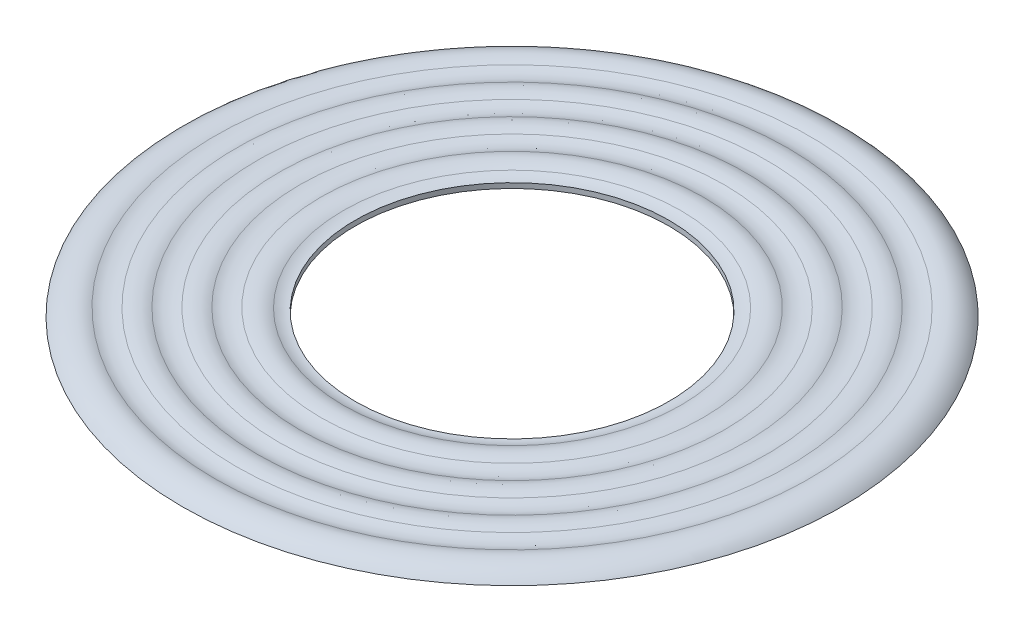
ISO-10303-21;
HEADER;
FILE_DESCRIPTION(('STEP AP214'),'2;1');
FILE_NAME('part.step','',(''),(''),'','','');
FILE_SCHEMA(('AUTOMOTIVE_DESIGN { 1 0 10303 214 1 1 1 1 }'));
ENDSEC;
DATA;
#1=APPLICATION_CONTEXT('core data for automotive mechanical design processes');
#2=APPLICATION_PROTOCOL_DEFINITION('international standard','automotive_design',2000,#1);
#3=PRODUCT_CONTEXT('',#1,'mechanical');
#4=PRODUCT('Part','Part','',(#3));
#5=PRODUCT_RELATED_PRODUCT_CATEGORY('part','',(#4));
#6=PRODUCT_DEFINITION_FORMATION('','',#4);
#7=PRODUCT_DEFINITION_CONTEXT('part definition',#1,'design');
#8=PRODUCT_DEFINITION('design','',#6,#7);
#9=PRODUCT_DEFINITION_SHAPE('','',#8);
#10=(LENGTH_UNIT() NAMED_UNIT(*) SI_UNIT(.MILLI.,.METRE.));
#11=(NAMED_UNIT(*) PLANE_ANGLE_UNIT() SI_UNIT($,.RADIAN.));
#12=(NAMED_UNIT(*) SI_UNIT($,.STERADIAN.) SOLID_ANGLE_UNIT());
#13=UNCERTAINTY_MEASURE_WITH_UNIT(LENGTH_MEASURE(1.E-05),#10,'distance_accuracy_value','');
#14=(GEOMETRIC_REPRESENTATION_CONTEXT(3) GLOBAL_UNCERTAINTY_ASSIGNED_CONTEXT((#13)) GLOBAL_UNIT_ASSIGNED_CONTEXT((#10,
#11,#12)) REPRESENTATION_CONTEXT('',''));
#15=CARTESIAN_POINT('',(0.,0.,0.));
#16=DIRECTION('',(0.,0.,1.));
#17=DIRECTION('',(1.,0.,0.));
#18=AXIS2_PLACEMENT_3D('',#15,#16,#17);
#19=CARTESIAN_POINT('',(-33.3375,-0.508,0.));
#20=DIRECTION('',(0.,-1.,0.));
#21=DIRECTION('',(0.,0.,-1.));
#22=AXIS2_PLACEMENT_3D('',#19,#20,#21);
#23=PLANE('',#22);
#24=CARTESIAN_POINT('',(0.,-0.508000000000002,0.));
#25=DIRECTION('',(0.,1.,0.));
#26=DIRECTION('',(0.,0.,1.));
#27=AXIS2_PLACEMENT_3D('',#24,#25,#26);
#28=CIRCLE('',#27,15.875);
#29=CARTESIAN_POINT('',(0.,-0.508000000000002,15.875));
#30=VERTEX_POINT('',#29);
#31=EDGE_CURVE('E69',#30,#30,#28,.T.);
#32=ORIENTED_EDGE('',*,*,#31,.T.);
#33=EDGE_LOOP('',(#32));
#34=FACE_BOUND('',#33,.T.);
#35=CARTESIAN_POINT('',(0.,-0.508,0.));
#36=DIRECTION('',(0.,-1.,0.));
#37=DIRECTION('',(0.,0.,-1.));
#38=AXIS2_PLACEMENT_3D('',#35,#36,#37);
#39=CIRCLE('',#38,16.7166681342821);
#40=CARTESIAN_POINT('',(0.,-0.508,-16.7166681342821));
#41=VERTEX_POINT('',#40);
#42=EDGE_CURVE('E84',#41,#41,#39,.T.);
#43=ORIENTED_EDGE('',*,*,#42,.T.);
#44=EDGE_LOOP('',(#43));
#45=FACE_BOUND('',#44,.T.);
#46=ADVANCED_FACE('F34',(#34,#45),#23,.T.);
#47=CARTESIAN_POINT('',(0.,-0.507999999999998,0.));
#48=DIRECTION('',(0.,1.,0.));
#49=DIRECTION('',(0.,0.,1.));
#50=AXIS2_PLACEMENT_3D('',#47,#48,#49);
#51=CIRCLE('',#50,33.3375);
#52=CARTESIAN_POINT('',(0.,-0.507999999999998,33.3375));
#53=VERTEX_POINT('',#52);
#54=EDGE_CURVE('E73',#53,#53,#51,.T.);
#55=ORIENTED_EDGE('',*,*,#54,.F.);
#56=EDGE_LOOP('',(#55));
#57=FACE_BOUND('',#56,.T.);
#58=CARTESIAN_POINT('',(0.,-0.508,0.));
#59=DIRECTION('',(0.,-1.,0.));
#60=DIRECTION('',(0.,0.,-1.));
#61=AXIS2_PLACEMENT_3D('',#58,#59,#60);
#62=CIRCLE('',#61,32.4312477668388);
#63=CARTESIAN_POINT('',(0.,-0.508,-32.4312477668388));
#64=VERTEX_POINT('',#63);
#65=EDGE_CURVE('E89',#64,#64,#62,.F.);
#66=ORIENTED_EDGE('',*,*,#65,.T.);
#67=EDGE_LOOP('',(#66));
#68=FACE_BOUND('',#67,.T.);
#69=ADVANCED_FACE('F160',(#57,#68),#23,.T.);
#70=CARTESIAN_POINT('',(0.,-2.41944630052116,0.));
#71=DIRECTION('',(0.,1.,0.));
#72=DIRECTION('',(0.,0.,1.));
#73=AXIS2_PLACEMENT_3D('',#70,#71,#72);
#74=TOROIDAL_SURFACE('',#73,26.8336418073314,2.92744630052116);
#75=CARTESIAN_POINT('',(0.,0.304799999999997,0.));
#76=DIRECTION('',(0.,1.,0.));
#77=DIRECTION('',(0.,0.,1.));
#78=AXIS2_PLACEMENT_3D('',#75,#76,#77);
#79=CIRCLE('',#78,27.9052872414801);
#80=CARTESIAN_POINT('',(0.,0.304799999999997,27.9052872414801));
#81=VERTEX_POINT('',#80);
#82=EDGE_CURVE('E80',#81,#81,#79,.T.);
#83=ORIENTED_EDGE('',*,*,#82,.T.);
#84=EDGE_LOOP('',(#83));
#85=FACE_BOUND('',#84,.T.);
#86=CARTESIAN_POINT('',(0.,0.304800000000001,0.));
#87=DIRECTION('',(0.,1.,0.));
#88=DIRECTION('',(0.,0.,1.));
#89=AXIS2_PLACEMENT_3D('',#86,#87,#88);
#90=CIRCLE('',#89,25.7619963731826);
#91=CARTESIAN_POINT('',(0.,0.304800000000001,25.7619963731826));
#92=VERTEX_POINT('',#91);
#93=EDGE_CURVE('E10',#92,#92,#90,.T.);
#94=ORIENTED_EDGE('',*,*,#93,.F.);
#95=EDGE_LOOP('',(#94));
#96=FACE_BOUND('',#95,.T.);
#97=ADVANCED_FACE('F36',(#85,#96),#74,.T.);
#98=CARTESIAN_POINT('',(0.,3.02904630052116,0.));
#99=DIRECTION('',(0.,1.,0.));
#100=DIRECTION('',(0.,0.,1.));
#101=AXIS2_PLACEMENT_3D('',#98,#99,#100);
#102=TOROIDAL_SURFACE('',#101,24.6903509390339,2.92744630052116);
#103=ORIENTED_EDGE('',*,*,#93,.T.);
#104=EDGE_LOOP('',(#103));
#105=FACE_BOUND('',#104,.T.);
#106=CARTESIAN_POINT('',(0.,0.304799999999997,0.));
#107=DIRECTION('',(0.,1.,0.));
#108=DIRECTION('',(0.,0.,1.));
#109=AXIS2_PLACEMENT_3D('',#106,#107,#108);
#110=CIRCLE('',#109,23.6187055048852);
#111=CARTESIAN_POINT('',(0.,0.304799999999997,23.6187055048852));
#112=VERTEX_POINT('',#111);
#113=EDGE_CURVE('E42',#112,#112,#110,.T.);
#114=ORIENTED_EDGE('',*,*,#113,.F.);
#115=EDGE_LOOP('',(#114));
#116=FACE_BOUND('',#115,.T.);
#117=ADVANCED_FACE('F189',(#105,#116),#102,.F.);
#118=CARTESIAN_POINT('',(0.,-2.41944630052116,0.));
#119=DIRECTION('',(0.,1.,0.));
#120=DIRECTION('',(0.,0.,1.));
#121=AXIS2_PLACEMENT_3D('',#118,#119,#120);
#122=TOROIDAL_SURFACE('',#121,22.5470600707365,2.92744630052116);
#123=ORIENTED_EDGE('',*,*,#113,.T.);
#124=EDGE_LOOP('',(#123));
#125=FACE_BOUND('',#124,.T.);
#126=CARTESIAN_POINT('',(0.,0.304800000000001,0.));
#127=DIRECTION('',(0.,1.,0.));
#128=DIRECTION('',(0.,0.,1.));
#129=AXIS2_PLACEMENT_3D('',#126,#127,#128);
#130=CIRCLE('',#129,21.4754146365878);
#131=CARTESIAN_POINT('',(0.,0.304800000000001,21.4754146365878));
#132=VERTEX_POINT('',#131);
#133=EDGE_CURVE('E49',#132,#132,#130,.T.);
#134=ORIENTED_EDGE('',*,*,#133,.F.);
#135=EDGE_LOOP('',(#134));
#136=FACE_BOUND('',#135,.T.);
#137=ADVANCED_FACE('F186',(#125,#136),#122,.T.);
#138=CARTESIAN_POINT('',(0.,3.02904630052116,0.));
#139=DIRECTION('',(0.,1.,0.));
#140=DIRECTION('',(0.,0.,1.));
#141=AXIS2_PLACEMENT_3D('',#138,#139,#140);
#142=TOROIDAL_SURFACE('',#141,20.403769202439,2.92744630052116);
#143=ORIENTED_EDGE('',*,*,#133,.T.);
#144=EDGE_LOOP('',(#143));
#145=FACE_BOUND('',#144,.T.);
#146=CARTESIAN_POINT('',(0.,0.304800000000001,0.));
#147=DIRECTION('',(0.,1.,0.));
#148=DIRECTION('',(0.,0.,1.));
#149=AXIS2_PLACEMENT_3D('',#146,#147,#148);
#150=CIRCLE('',#149,19.3321237682903);
#151=CARTESIAN_POINT('',(0.,0.304800000000001,19.3321237682903));
#152=VERTEX_POINT('',#151);
#153=EDGE_CURVE('E55',#152,#152,#150,.T.);
#154=ORIENTED_EDGE('',*,*,#153,.F.);
#155=EDGE_LOOP('',(#154));
#156=FACE_BOUND('',#155,.T.);
#157=ADVANCED_FACE('F182',(#145,#156),#142,.F.);
#158=CARTESIAN_POINT('',(0.,-2.41944630052116,0.));
#159=DIRECTION('',(0.,1.,0.));
#160=DIRECTION('',(0.,0.,1.));
#161=AXIS2_PLACEMENT_3D('',#158,#159,#160);
#162=TOROIDAL_SURFACE('',#161,18.2604783341416,2.92744630052116);
#163=ORIENTED_EDGE('',*,*,#153,.T.);
#164=EDGE_LOOP('',(#163));
#165=FACE_BOUND('',#164,.T.);
#166=CARTESIAN_POINT('',(0.,0.254000000000001,0.));
#167=DIRECTION('',(0.,1.,0.));
#168=DIRECTION('',(0.,0.,1.));
#169=AXIS2_PLACEMENT_3D('',#166,#167,#168);
#170=CIRCLE('',#169,17.0677391670708);
#171=CARTESIAN_POINT('',(0.,0.254000000000001,17.0677391670708));
#172=VERTEX_POINT('',#171);
#173=EDGE_CURVE('E61',#172,#172,#170,.T.);
#174=ORIENTED_EDGE('',*,*,#173,.F.);
#175=EDGE_LOOP('',(#174));
#176=FACE_BOUND('',#175,.T.);
#177=ADVANCED_FACE('F178',(#165,#176),#162,.T.);
#178=CARTESIAN_POINT('',(0.,2.92744630052116,0.));
#179=DIRECTION('',(0.,1.,0.));
#180=DIRECTION('',(0.,0.,1.));
#181=AXIS2_PLACEMENT_3D('',#178,#179,#180);
#182=TOROIDAL_SURFACE('',#181,15.875,2.92744630052116);
#183=ORIENTED_EDGE('',*,*,#173,.T.);
#184=EDGE_LOOP('',(#183));
#185=FACE_BOUND('',#184,.T.);
#186=CARTESIAN_POINT('',(0.,0.,0.));
#187=DIRECTION('',(0.,1.,0.));
#188=DIRECTION('',(0.,0.,1.));
#189=AXIS2_PLACEMENT_3D('',#186,#187,#188);
#190=CIRCLE('',#189,15.875);
#191=CARTESIAN_POINT('',(0.,0.,15.875));
#192=VERTEX_POINT('',#191);
#193=EDGE_CURVE('E65',#192,#192,#190,.T.);
#194=ORIENTED_EDGE('',*,*,#193,.F.);
#195=EDGE_LOOP('',(#194));
#196=FACE_BOUND('',#195,.T.);
#197=ADVANCED_FACE('F174',(#185,#196),#182,.F.);
#198=CARTESIAN_POINT('',(0.,27.3110188354798,0.));
#199=DIRECTION('',(0.,1.,0.));
#200=DIRECTION('',(0.,0.,1.));
#201=AXIS2_PLACEMENT_3D('',#198,#199,#200);
#202=CYLINDRICAL_SURFACE('',#201,15.875);
#203=ORIENTED_EDGE('',*,*,#193,.T.);
#204=EDGE_LOOP('',(#203));
#205=FACE_BOUND('',#204,.T.);
#206=ORIENTED_EDGE('',*,*,#31,.F.);
#207=EDGE_LOOP('',(#206));
#208=FACE_BOUND('',#207,.T.);
#209=ADVANCED_FACE('F171',(#205,#208),#202,.F.);
#210=CARTESIAN_POINT('',(0.,-2.41944630052116,0.));
#211=DIRECTION('',(0.,1.,0.));
#212=DIRECTION('',(0.,0.,1.));
#213=AXIS2_PLACEMENT_3D('',#210,#211,#212);
#214=TOROIDAL_SURFACE('',#213,31.1202235439262,2.92744630052116);
#215=ORIENTED_EDGE('',*,*,#54,.T.);
#216=EDGE_LOOP('',(#215));
#217=FACE_BOUND('',#216,.T.);
#218=CARTESIAN_POINT('',(0.,0.304800000000001,0.));
#219=DIRECTION('',(0.,1.,0.));
#220=DIRECTION('',(0.,0.,1.));
#221=AXIS2_PLACEMENT_3D('',#218,#219,#220);
#222=CIRCLE('',#221,30.0485781097775);
#223=CARTESIAN_POINT('',(0.,0.304800000000001,30.0485781097775));
#224=VERTEX_POINT('',#223);
#225=EDGE_CURVE('E76',#224,#224,#222,.T.);
#226=ORIENTED_EDGE('',*,*,#225,.F.);
#227=EDGE_LOOP('',(#226));
#228=FACE_BOUND('',#227,.T.);
#229=ADVANCED_FACE('F169',(#217,#228),#214,.T.);
#230=CARTESIAN_POINT('',(0.,3.02904630052116,0.));
#231=DIRECTION('',(0.,1.,0.));
#232=DIRECTION('',(0.,0.,1.));
#233=AXIS2_PLACEMENT_3D('',#230,#231,#232);
#234=TOROIDAL_SURFACE('',#233,28.9769326756288,2.92744630052116);
#235=ORIENTED_EDGE('',*,*,#225,.T.);
#236=EDGE_LOOP('',(#235));
#237=FACE_BOUND('',#236,.T.);
#238=ORIENTED_EDGE('',*,*,#82,.F.);
#239=EDGE_LOOP('',(#238));
#240=FACE_BOUND('',#239,.T.);
#241=ADVANCED_FACE('F155',(#237,#240),#234,.F.);
#242=CARTESIAN_POINT('',(0.,2.92744630052116,0.));
#243=DIRECTION('',(0.,1.,0.));
#244=DIRECTION('',(0.,0.,1.));
#245=AXIS2_PLACEMENT_3D('',#242,#243,#244);
#246=TOROIDAL_SURFACE('',#245,15.875,3.53704630052116);
#247=CARTESIAN_POINT('',(0.,-0.302708030650317,0.));
#248=DIRECTION('',(0.,1.,0.));
#249=DIRECTION('',(0.,0.,1.));
#250=AXIS2_PLACEMENT_3D('',#247,#248,#249);
#251=CIRCLE('',#250,17.3161105193026);
#252=CARTESIAN_POINT('',(0.,-0.302708030650317,17.3161105193026));
#253=VERTEX_POINT('',#252);
#254=EDGE_CURVE('E93',#253,#253,#251,.T.);
#255=ORIENTED_EDGE('',*,*,#254,.F.);
#256=EDGE_LOOP('',(#255));
#257=FACE_BOUND('',#256,.T.);
#258=ORIENTED_EDGE('',*,*,#42,.F.);
#259=EDGE_LOOP('',(#258));
#260=FACE_BOUND('',#259,.T.);
#261=ADVANCED_FACE('F125',(#257,#260),#246,.T.);
#262=CARTESIAN_POINT('',(0.,-2.41944630052116,0.));
#263=DIRECTION('',(0.,1.,0.));
#264=DIRECTION('',(0.,0.,1.));
#265=AXIS2_PLACEMENT_3D('',#262,#263,#264);
#266=TOROIDAL_SURFACE('',#265,26.8336418073314,2.31784630052116);
#267=CARTESIAN_POINT('',(0.,-0.262486424520255,0.));
#268=DIRECTION('',(0.,1.,0.));
#269=DIRECTION('',(0.,0.,1.));
#270=AXIS2_PLACEMENT_3D('',#267,#268,#269);
#271=CIRCLE('',#270,27.6821319759024);
#272=CARTESIAN_POINT('',(0.,-0.262486424520255,27.6821319759024));
#273=VERTEX_POINT('',#272);
#274=EDGE_CURVE('E98',#273,#273,#271,.T.);
#275=ORIENTED_EDGE('',*,*,#274,.F.);
#276=EDGE_LOOP('',(#275));
#277=FACE_BOUND('',#276,.T.);
#278=CARTESIAN_POINT('',(0.,-0.262486424520255,0.));
#279=DIRECTION('',(0.,1.,0.));
#280=DIRECTION('',(0.,0.,1.));
#281=AXIS2_PLACEMENT_3D('',#278,#279,#280);
#282=CIRCLE('',#281,25.9851516387603);
#283=CARTESIAN_POINT('',(0.,-0.262486424520255,25.9851516387603));
#284=VERTEX_POINT('',#283);
#285=EDGE_CURVE('E88',#284,#284,#282,.T.);
#286=ORIENTED_EDGE('',*,*,#285,.T.);
#287=EDGE_LOOP('',(#286));
#288=FACE_BOUND('',#287,.T.);
#289=ADVANCED_FACE('F121',(#277,#288),#266,.F.);
#290=CARTESIAN_POINT('',(0.,3.02904630052116,0.));
#291=DIRECTION('',(0.,1.,0.));
#292=DIRECTION('',(0.,0.,1.));
#293=AXIS2_PLACEMENT_3D('',#290,#291,#292);
#294=TOROIDAL_SURFACE('',#293,24.6903509390339,3.53704630052116);
#295=ORIENTED_EDGE('',*,*,#285,.F.);
#296=EDGE_LOOP('',(#295));
#297=FACE_BOUND('',#296,.T.);
#298=CARTESIAN_POINT('',(0.,-0.262486424520258,0.));
#299=DIRECTION('',(0.,1.,0.));
#300=DIRECTION('',(0.,0.,1.));
#301=AXIS2_PLACEMENT_3D('',#298,#299,#300);
#302=CIRCLE('',#301,23.3955502393076);
#303=CARTESIAN_POINT('',(0.,-0.262486424520258,23.3955502393076));
#304=VERTEX_POINT('',#303);
#305=EDGE_CURVE('E110',#304,#304,#302,.T.);
#306=ORIENTED_EDGE('',*,*,#305,.T.);
#307=EDGE_LOOP('',(#306));
#308=FACE_BOUND('',#307,.T.);
#309=ADVANCED_FACE('F124',(#297,#308),#294,.T.);
#310=CARTESIAN_POINT('',(0.,-2.41944630052116,0.));
#311=DIRECTION('',(0.,1.,0.));
#312=DIRECTION('',(0.,0.,1.));
#313=AXIS2_PLACEMENT_3D('',#310,#311,#312);
#314=TOROIDAL_SURFACE('',#313,22.5470600707365,2.31784630052116);
#315=ORIENTED_EDGE('',*,*,#305,.F.);
#316=EDGE_LOOP('',(#315));
#317=FACE_BOUND('',#316,.T.);
#318=CARTESIAN_POINT('',(0.,-0.262486424520257,0.));
#319=DIRECTION('',(0.,1.,0.));
#320=DIRECTION('',(0.,0.,1.));
#321=AXIS2_PLACEMENT_3D('',#318,#319,#320);
#322=CIRCLE('',#321,21.6985699021654);
#323=CARTESIAN_POINT('',(0.,-0.262486424520257,21.6985699021654));
#324=VERTEX_POINT('',#323);
#325=EDGE_CURVE('E106',#324,#324,#322,.T.);
#326=ORIENTED_EDGE('',*,*,#325,.T.);
#327=EDGE_LOOP('',(#326));
#328=FACE_BOUND('',#327,.T.);
#329=ADVANCED_FACE('F131',(#317,#328),#314,.F.);
#330=CARTESIAN_POINT('',(0.,3.02904630052116,0.));
#331=DIRECTION('',(0.,1.,0.));
#332=DIRECTION('',(0.,0.,1.));
#333=AXIS2_PLACEMENT_3D('',#330,#331,#332);
#334=TOROIDAL_SURFACE('',#333,20.403769202439,3.53704630052116);
#335=ORIENTED_EDGE('',*,*,#325,.F.);
#336=EDGE_LOOP('',(#335));
#337=FACE_BOUND('',#336,.T.);
#338=CARTESIAN_POINT('',(0.,-0.262486424520256,0.));
#339=DIRECTION('',(0.,1.,0.));
#340=DIRECTION('',(0.,0.,1.));
#341=AXIS2_PLACEMENT_3D('',#338,#339,#340);
#342=CIRCLE('',#341,19.1089685027127);
#343=CARTESIAN_POINT('',(0.,-0.262486424520256,19.1089685027127));
#344=VERTEX_POINT('',#343);
#345=EDGE_CURVE('E102',#344,#344,#342,.T.);
#346=ORIENTED_EDGE('',*,*,#345,.T.);
#347=EDGE_LOOP('',(#346));
#348=FACE_BOUND('',#347,.T.);
#349=ADVANCED_FACE('F137',(#337,#348),#334,.T.);
#350=CARTESIAN_POINT('',(0.,-2.41944630052116,0.));
#351=DIRECTION('',(0.,1.,0.));
#352=DIRECTION('',(0.,0.,1.));
#353=AXIS2_PLACEMENT_3D('',#350,#351,#352);
#354=TOROIDAL_SURFACE('',#353,18.2604783341416,2.31784630052116);
#355=ORIENTED_EDGE('',*,*,#345,.F.);
#356=EDGE_LOOP('',(#355));
#357=FACE_BOUND('',#356,.T.);
#358=ORIENTED_EDGE('',*,*,#254,.T.);
#359=EDGE_LOOP('',(#358));
#360=FACE_BOUND('',#359,.T.);
#361=ADVANCED_FACE('F143',(#357,#360),#354,.F.);
#362=CARTESIAN_POINT('',(0.,-2.41944630052116,0.));
#363=DIRECTION('',(0.,1.,0.));
#364=DIRECTION('',(0.,0.,1.));
#365=AXIS2_PLACEMENT_3D('',#362,#363,#364);
#366=TOROIDAL_SURFACE('',#365,31.1202235439262,2.31784630052116);
#367=ORIENTED_EDGE('',*,*,#65,.F.);
#368=EDGE_LOOP('',(#367));
#369=FACE_BOUND('',#368,.T.);
#370=CARTESIAN_POINT('',(0.,-0.262486424520256,0.));
#371=DIRECTION('',(0.,1.,0.));
#372=DIRECTION('',(0.,0.,1.));
#373=AXIS2_PLACEMENT_3D('',#370,#371,#372);
#374=CIRCLE('',#373,30.2717333753551);
#375=CARTESIAN_POINT('',(0.,-0.262486424520256,30.2717333753551));
#376=VERTEX_POINT('',#375);
#377=EDGE_CURVE('E94',#376,#376,#374,.T.);
#378=ORIENTED_EDGE('',*,*,#377,.T.);
#379=EDGE_LOOP('',(#378));
#380=FACE_BOUND('',#379,.T.);
#381=ADVANCED_FACE('F149',(#369,#380),#366,.F.);
#382=CARTESIAN_POINT('',(0.,3.02904630052116,0.));
#383=DIRECTION('',(0.,1.,0.));
#384=DIRECTION('',(0.,0.,1.));
#385=AXIS2_PLACEMENT_3D('',#382,#383,#384);
#386=TOROIDAL_SURFACE('',#385,28.9769326756288,3.53704630052116);
#387=ORIENTED_EDGE('',*,*,#377,.F.);
#388=EDGE_LOOP('',(#387));
#389=FACE_BOUND('',#388,.T.);
#390=ORIENTED_EDGE('',*,*,#274,.T.);
#391=EDGE_LOOP('',(#390));
#392=FACE_BOUND('',#391,.T.);
#393=ADVANCED_FACE('F119',(#389,#392),#386,.T.);
#394=CLOSED_SHELL('',(#46,#69,#97,#117,#137,#157,#177,#197,#209,#229,#241,#261,#289,#309,#329,
#349,#361,#381,#393));
#395=MANIFOLD_SOLID_BREP('B2',#394);
#396=ADVANCED_BREP_SHAPE_REPRESENTATION('',(#18,#395),#14);
#397=SHAPE_DEFINITION_REPRESENTATION(#9,#396);
ENDSEC;
END-ISO-10303-21;
